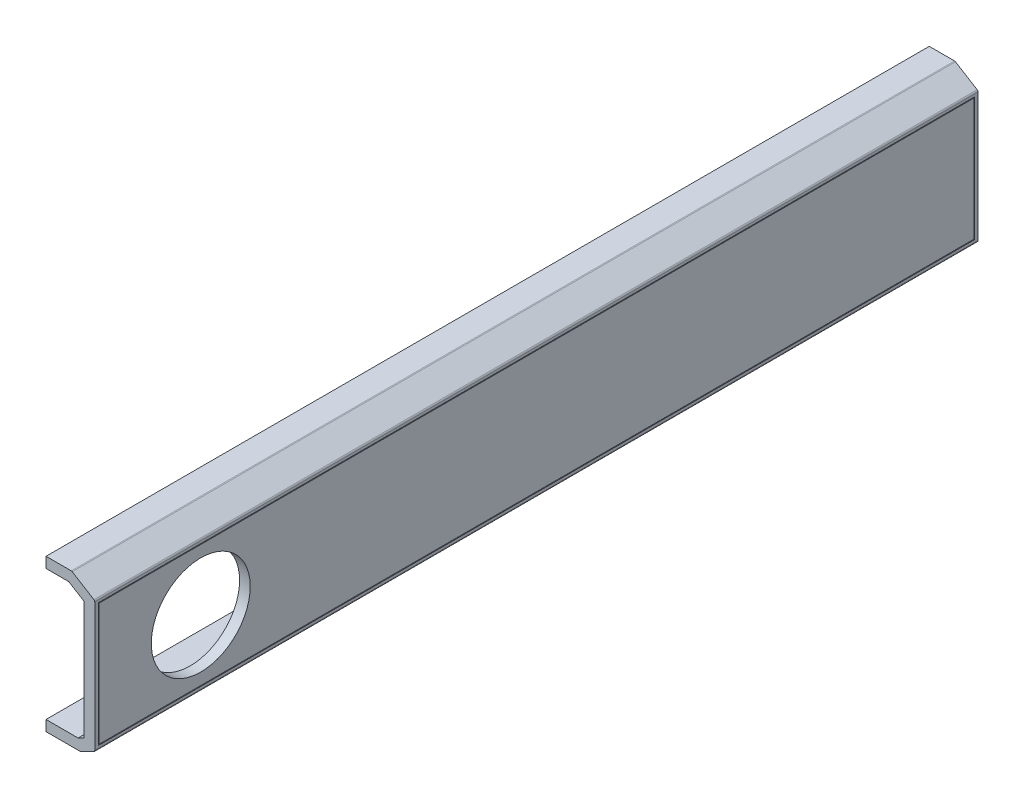
ISO-10303-21;
HEADER;
FILE_DESCRIPTION(('STEP AP214'),'2;1');
FILE_NAME('part.step','',(''),(''),'','','');
FILE_SCHEMA(('AUTOMOTIVE_DESIGN { 1 0 10303 214 1 1 1 1 }'));
ENDSEC;
DATA;
#1=APPLICATION_CONTEXT('core data for automotive mechanical design processes');
#2=APPLICATION_PROTOCOL_DEFINITION('international standard','automotive_design',2000,#1);
#3=PRODUCT_CONTEXT('',#1,'mechanical');
#4=PRODUCT('Part','Part','',(#3));
#5=PRODUCT_RELATED_PRODUCT_CATEGORY('part','',(#4));
#6=PRODUCT_DEFINITION_FORMATION('','',#4);
#7=PRODUCT_DEFINITION_CONTEXT('part definition',#1,'design');
#8=PRODUCT_DEFINITION('design','',#6,#7);
#9=PRODUCT_DEFINITION_SHAPE('','',#8);
#10=(LENGTH_UNIT() NAMED_UNIT(*) SI_UNIT(.MILLI.,.METRE.));
#11=(NAMED_UNIT(*) PLANE_ANGLE_UNIT() SI_UNIT($,.RADIAN.));
#12=(NAMED_UNIT(*) SI_UNIT($,.STERADIAN.) SOLID_ANGLE_UNIT());
#13=UNCERTAINTY_MEASURE_WITH_UNIT(LENGTH_MEASURE(1.E-05),#10,'distance_accuracy_value','');
#14=(GEOMETRIC_REPRESENTATION_CONTEXT(3) GLOBAL_UNCERTAINTY_ASSIGNED_CONTEXT((#13)) GLOBAL_UNIT_ASSIGNED_CONTEXT((#10,
#11,#12)) REPRESENTATION_CONTEXT('',''));
#15=CARTESIAN_POINT('',(0.,0.,0.));
#16=DIRECTION('',(0.,0.,1.));
#17=DIRECTION('',(1.,0.,0.));
#18=AXIS2_PLACEMENT_3D('',#15,#16,#17);
#19=CARTESIAN_POINT('',(13.6,0.,0.));
#20=DIRECTION('',(1.,0.,0.));
#21=DIRECTION('',(0.,0.,-1.));
#22=AXIS2_PLACEMENT_3D('',#19,#20,#21);
#23=PLANE('',#22);
#24=DIRECTION('',(0.,0.,1.));
#25=VECTOR('',#24,1.);
#26=CARTESIAN_POINT('',(13.6,38.,1.));
#27=LINE('',#26,#25);
#28=CARTESIAN_POINT('',(13.6,38.,1.));
#29=VERTEX_POINT('',#28);
#30=CARTESIAN_POINT('',(13.6,38.,249.));
#31=VERTEX_POINT('',#30);
#32=EDGE_CURVE('E466',#29,#31,#27,.T.);
#33=ORIENTED_EDGE('',*,*,#32,.T.);
#34=DIRECTION('',(0.,1.,0.));
#35=VECTOR('',#34,1.);
#36=CARTESIAN_POINT('',(13.6,38.,249.));
#37=LINE('',#36,#35);
#38=CARTESIAN_POINT('',(13.6,3.,249.));
#39=VERTEX_POINT('',#38);
#40=EDGE_CURVE('E461',#31,#39,#37,.F.);
#41=ORIENTED_EDGE('',*,*,#40,.T.);
#42=DIRECTION('',(0.,0.,-1.));
#43=VECTOR('',#42,1.);
#44=CARTESIAN_POINT('',(13.6,3.,249.));
#45=LINE('',#44,#43);
#46=CARTESIAN_POINT('',(13.6,3.,1.));
#47=VERTEX_POINT('',#46);
#48=EDGE_CURVE('E456',#39,#47,#45,.T.);
#49=ORIENTED_EDGE('',*,*,#48,.T.);
#50=DIRECTION('',(0.,1.,0.));
#51=VECTOR('',#50,1.);
#52=CARTESIAN_POINT('',(13.6,3.,1.));
#53=LINE('',#52,#51);
#54=EDGE_CURVE('E450',#47,#29,#53,.T.);
#55=ORIENTED_EDGE('',*,*,#54,.T.);
#56=EDGE_LOOP('',(#33,#41,#49,#55));
#57=FACE_BOUND('',#56,.T.);
#58=DIRECTION('',(0.,1.,0.));
#59=VECTOR('',#58,1.);
#60=CARTESIAN_POINT('',(13.6,37.8,248.8));
#61=LINE('',#60,#59);
#62=CARTESIAN_POINT('',(13.6,37.8,248.8));
#63=VERTEX_POINT('',#62);
#64=CARTESIAN_POINT('',(13.6,3.2,248.8));
#65=VERTEX_POINT('',#64);
#66=EDGE_CURVE('E477',#63,#65,#61,.F.);
#67=ORIENTED_EDGE('',*,*,#66,.F.);
#68=DIRECTION('',(0.,0.,1.));
#69=VECTOR('',#68,1.);
#70=CARTESIAN_POINT('',(13.6,37.8,1.2));
#71=LINE('',#70,#69);
#72=CARTESIAN_POINT('',(13.6,37.8,1.2));
#73=VERTEX_POINT('',#72);
#74=EDGE_CURVE('E470',#73,#63,#71,.T.);
#75=ORIENTED_EDGE('',*,*,#74,.F.);
#76=DIRECTION('',(0.,1.,0.));
#77=VECTOR('',#76,1.);
#78=CARTESIAN_POINT('',(13.6,3.2,1.2));
#79=LINE('',#78,#77);
#80=CARTESIAN_POINT('',(13.6,3.2,1.2));
#81=VERTEX_POINT('',#80);
#82=EDGE_CURVE('E483',#81,#73,#79,.T.);
#83=ORIENTED_EDGE('',*,*,#82,.F.);
#84=DIRECTION('',(0.,0.,-1.));
#85=VECTOR('',#84,1.);
#86=CARTESIAN_POINT('',(13.6,3.2,248.8));
#87=LINE('',#86,#85);
#88=EDGE_CURVE('E481',#65,#81,#87,.T.);
#89=ORIENTED_EDGE('',*,*,#88,.F.);
#90=EDGE_LOOP('',(#67,#75,#83,#89));
#91=FACE_BOUND('',#90,.T.);
#92=ADVANCED_FACE('F17',(#57,#91),#23,.T.);
#93=CARTESIAN_POINT('',(13.6,3.2,1.2));
#94=DIRECTION('',(0.,0.,-1.));
#95=DIRECTION('',(-1.,0.,0.));
#96=AXIS2_PLACEMENT_3D('',#93,#94,#95);
#97=PLANE('',#96);
#98=ORIENTED_EDGE('',*,*,#82,.T.);
#99=DIRECTION('',(1.,0.,0.));
#100=VECTOR('',#99,1.);
#101=CARTESIAN_POINT('',(13.6,37.8,1.2));
#102=LINE('',#101,#100);
#103=CARTESIAN_POINT('',(13.8,37.8,1.2));
#104=VERTEX_POINT('',#103);
#105=EDGE_CURVE('E472',#104,#73,#102,.F.);
#106=ORIENTED_EDGE('',*,*,#105,.F.);
#107=DIRECTION('',(0.,1.,0.));
#108=VECTOR('',#107,1.);
#109=CARTESIAN_POINT('',(13.8,2.,1.20000000000001));
#110=LINE('',#109,#108);
#111=CARTESIAN_POINT('',(13.8,3.2,1.2));
#112=VERTEX_POINT('',#111);
#113=EDGE_CURVE('E444',#104,#112,#110,.F.);
#114=ORIENTED_EDGE('',*,*,#113,.T.);
#115=DIRECTION('',(1.,0.,0.));
#116=VECTOR('',#115,1.);
#117=CARTESIAN_POINT('',(13.6,3.2,1.20000000000001));
#118=LINE('',#117,#116);
#119=EDGE_CURVE('E479',#81,#112,#118,.T.);
#120=ORIENTED_EDGE('',*,*,#119,.F.);
#121=EDGE_LOOP('',(#98,#106,#114,#120));
#122=FACE_BOUND('',#121,.T.);
#123=ADVANCED_FACE('F889',(#122),#97,.T.);
#124=CARTESIAN_POINT('',(13.6,3.2,248.8));
#125=DIRECTION('',(0.,-1.,0.));
#126=DIRECTION('',(0.,0.,-1.));
#127=AXIS2_PLACEMENT_3D('',#124,#125,#126);
#128=PLANE('',#127);
#129=ORIENTED_EDGE('',*,*,#88,.T.);
#130=ORIENTED_EDGE('',*,*,#119,.T.);
#131=DIRECTION('',(0.,0.,1.));
#132=VECTOR('',#131,1.);
#133=CARTESIAN_POINT('',(13.8,3.2,250.));
#134=LINE('',#133,#132);
#135=CARTESIAN_POINT('',(13.8,3.2,248.8));
#136=VERTEX_POINT('',#135);
#137=EDGE_CURVE('E441',#112,#136,#134,.T.);
#138=ORIENTED_EDGE('',*,*,#137,.T.);
#139=DIRECTION('',(1.,0.,0.));
#140=VECTOR('',#139,1.);
#141=CARTESIAN_POINT('',(13.6,3.2,248.8));
#142=LINE('',#141,#140);
#143=EDGE_CURVE('E475',#65,#136,#142,.T.);
#144=ORIENTED_EDGE('',*,*,#143,.F.);
#145=EDGE_LOOP('',(#129,#130,#138,#144));
#146=FACE_BOUND('',#145,.T.);
#147=ADVANCED_FACE('F880',(#146),#128,.T.);
#148=CARTESIAN_POINT('',(13.6,37.8,248.8));
#149=DIRECTION('',(0.,0.,1.));
#150=DIRECTION('',(1.,0.,0.));
#151=AXIS2_PLACEMENT_3D('',#148,#149,#150);
#152=PLANE('',#151);
#153=ORIENTED_EDGE('',*,*,#66,.T.);
#154=ORIENTED_EDGE('',*,*,#143,.T.);
#155=DIRECTION('',(0.,1.,0.));
#156=VECTOR('',#155,1.);
#157=CARTESIAN_POINT('',(13.8,2.,248.8));
#158=LINE('',#157,#156);
#159=CARTESIAN_POINT('',(13.8,37.8,248.8));
#160=VERTEX_POINT('',#159);
#161=EDGE_CURVE('E438',#136,#160,#158,.T.);
#162=ORIENTED_EDGE('',*,*,#161,.T.);
#163=DIRECTION('',(1.,0.,0.));
#164=VECTOR('',#163,1.);
#165=CARTESIAN_POINT('',(13.6,37.8,248.8));
#166=LINE('',#165,#164);
#167=EDGE_CURVE('E468',#63,#160,#166,.T.);
#168=ORIENTED_EDGE('',*,*,#167,.F.);
#169=EDGE_LOOP('',(#153,#154,#162,#168));
#170=FACE_BOUND('',#169,.T.);
#171=ADVANCED_FACE('F871',(#170),#152,.T.);
#172=CARTESIAN_POINT('',(13.6,37.8,1.2));
#173=DIRECTION('',(0.,1.,0.));
#174=DIRECTION('',(0.,0.,1.));
#175=AXIS2_PLACEMENT_3D('',#172,#173,#174);
#176=PLANE('',#175);
#177=ORIENTED_EDGE('',*,*,#74,.T.);
#178=ORIENTED_EDGE('',*,*,#167,.T.);
#179=DIRECTION('',(0.,0.,1.));
#180=VECTOR('',#179,1.);
#181=CARTESIAN_POINT('',(13.8,37.8,250.));
#182=LINE('',#181,#180);
#183=EDGE_CURVE('E389',#160,#104,#182,.F.);
#184=ORIENTED_EDGE('',*,*,#183,.T.);
#185=ORIENTED_EDGE('',*,*,#105,.T.);
#186=EDGE_LOOP('',(#177,#178,#184,#185));
#187=FACE_BOUND('',#186,.T.);
#188=ADVANCED_FACE('F862',(#187),#176,.T.);
#189=CARTESIAN_POINT('',(13.6,38.,1.));
#190=DIRECTION('',(0.,1.,0.));
#191=DIRECTION('',(0.,0.,1.));
#192=AXIS2_PLACEMENT_3D('',#189,#190,#191);
#193=PLANE('',#192);
#194=DIRECTION('',(1.,0.,0.));
#195=VECTOR('',#194,1.);
#196=CARTESIAN_POINT('',(13.6,38.,249.));
#197=LINE('',#196,#195);
#198=CARTESIAN_POINT('',(13.8,38.,249.));
#199=VERTEX_POINT('',#198);
#200=EDGE_CURVE('E463',#199,#31,#197,.F.);
#201=ORIENTED_EDGE('',*,*,#200,.T.);
#202=ORIENTED_EDGE('',*,*,#32,.F.);
#203=DIRECTION('',(-1.,0.,0.));
#204=VECTOR('',#203,1.);
#205=CARTESIAN_POINT('',(13.6,38.,1.));
#206=LINE('',#205,#204);
#207=CARTESIAN_POINT('',(13.8,38.,1.));
#208=VERTEX_POINT('',#207);
#209=EDGE_CURVE('E219',#29,#208,#206,.F.);
#210=ORIENTED_EDGE('',*,*,#209,.T.);
#211=DIRECTION('',(0.,0.,1.));
#212=VECTOR('',#211,1.);
#213=CARTESIAN_POINT('',(13.8,38.,250.));
#214=LINE('',#213,#212);
#215=EDGE_CURVE('E328',#208,#199,#214,.T.);
#216=ORIENTED_EDGE('',*,*,#215,.T.);
#217=EDGE_LOOP('',(#201,#202,#210,#216));
#218=FACE_BOUND('',#217,.T.);
#219=ADVANCED_FACE('F853',(#218),#193,.F.);
#220=CARTESIAN_POINT('',(13.6,38.,249.));
#221=DIRECTION('',(0.,0.,1.));
#222=DIRECTION('',(1.,0.,0.));
#223=AXIS2_PLACEMENT_3D('',#220,#221,#222);
#224=PLANE('',#223);
#225=DIRECTION('',(1.,0.,0.));
#226=VECTOR('',#225,1.);
#227=CARTESIAN_POINT('',(13.6,3.,249.));
#228=LINE('',#227,#226);
#229=CARTESIAN_POINT('',(13.8,3.,249.));
#230=VERTEX_POINT('',#229);
#231=EDGE_CURVE('E458',#230,#39,#228,.F.);
#232=ORIENTED_EDGE('',*,*,#231,.T.);
#233=ORIENTED_EDGE('',*,*,#40,.F.);
#234=ORIENTED_EDGE('',*,*,#200,.F.);
#235=DIRECTION('',(0.,1.,0.));
#236=VECTOR('',#235,1.);
#237=CARTESIAN_POINT('',(13.8,2.,249.));
#238=LINE('',#237,#236);
#239=EDGE_CURVE('E325',#199,#230,#238,.F.);
#240=ORIENTED_EDGE('',*,*,#239,.T.);
#241=EDGE_LOOP('',(#232,#233,#234,#240));
#242=FACE_BOUND('',#241,.T.);
#243=ADVANCED_FACE('F844',(#242),#224,.F.);
#244=CARTESIAN_POINT('',(13.6,3.,249.));
#245=DIRECTION('',(0.,-1.,0.));
#246=DIRECTION('',(0.,0.,-1.));
#247=AXIS2_PLACEMENT_3D('',#244,#245,#246);
#248=PLANE('',#247);
#249=DIRECTION('',(-1.,0.,0.));
#250=VECTOR('',#249,1.);
#251=CARTESIAN_POINT('',(13.6,3.,1.));
#252=LINE('',#251,#250);
#253=CARTESIAN_POINT('',(13.8,3.,1.));
#254=VERTEX_POINT('',#253);
#255=EDGE_CURVE('E453',#254,#47,#252,.T.);
#256=ORIENTED_EDGE('',*,*,#255,.T.);
#257=ORIENTED_EDGE('',*,*,#48,.F.);
#258=ORIENTED_EDGE('',*,*,#231,.F.);
#259=DIRECTION('',(0.,0.,1.));
#260=VECTOR('',#259,1.);
#261=CARTESIAN_POINT('',(13.8,3.,250.));
#262=LINE('',#261,#260);
#263=EDGE_CURVE('E322',#230,#254,#262,.F.);
#264=ORIENTED_EDGE('',*,*,#263,.T.);
#265=EDGE_LOOP('',(#256,#257,#258,#264));
#266=FACE_BOUND('',#265,.T.);
#267=ADVANCED_FACE('F835',(#266),#248,.F.);
#268=CARTESIAN_POINT('',(13.6,3.,1.));
#269=DIRECTION('',(0.,0.,-1.));
#270=DIRECTION('',(-1.,0.,0.));
#271=AXIS2_PLACEMENT_3D('',#268,#269,#270);
#272=PLANE('',#271);
#273=ORIENTED_EDGE('',*,*,#209,.F.);
#274=ORIENTED_EDGE('',*,*,#54,.F.);
#275=ORIENTED_EDGE('',*,*,#255,.F.);
#276=DIRECTION('',(0.,1.,0.));
#277=VECTOR('',#276,1.);
#278=CARTESIAN_POINT('',(13.8,2.,1.));
#279=LINE('',#278,#277);
#280=EDGE_CURVE('E229',#254,#208,#279,.T.);
#281=ORIENTED_EDGE('',*,*,#280,.T.);
#282=EDGE_LOOP('',(#273,#274,#275,#281));
#283=FACE_BOUND('',#282,.T.);
#284=ADVANCED_FACE('F827',(#283),#272,.F.);
#285=CARTESIAN_POINT('',(13.3,38.7206024029818,250.));
#286=DIRECTION('',(0.,0.,-1.));
#287=DIRECTION('',(-1.,0.,0.));
#288=AXIS2_PLACEMENT_3D('',#285,#286,#287);
#289=CYLINDRICAL_SURFACE('',#288,0.5);
#290=CARTESIAN_POINT('',(13.3,38.7206024029818,0.));
#291=DIRECTION('',(0.,0.,-1.));
#292=DIRECTION('',(-1.,0.,0.));
#293=AXIS2_PLACEMENT_3D('',#290,#291,#292);
#294=CIRCLE('',#293,0.5);
#295=CARTESIAN_POINT('',(13.8,38.7206024029818,0.));
#296=VERTEX_POINT('',#295);
#297=CARTESIAN_POINT('',(13.5620487128322,39.1464315613341,0.));
#298=VERTEX_POINT('',#297);
#299=EDGE_CURVE('E218',#296,#298,#294,.F.);
#300=ORIENTED_EDGE('',*,*,#299,.T.);
#301=DIRECTION('',(0.,0.,1.));
#302=VECTOR('',#301,1.);
#303=CARTESIAN_POINT('',(13.5620487128322,39.1464315613341,250.));
#304=LINE('',#303,#302);
#305=CARTESIAN_POINT('',(13.5620487128322,39.1464315613341,250.));
#306=VERTEX_POINT('',#305);
#307=EDGE_CURVE('E216',#298,#306,#304,.T.);
#308=ORIENTED_EDGE('',*,*,#307,.T.);
#309=CARTESIAN_POINT('',(13.3,38.7206024029818,250.));
#310=DIRECTION('',(0.,0.,-1.));
#311=DIRECTION('',(-1.,0.,0.));
#312=AXIS2_PLACEMENT_3D('',#309,#310,#311);
#313=CIRCLE('',#312,0.5);
#314=CARTESIAN_POINT('',(13.8,38.7206024029818,250.));
#315=VERTEX_POINT('',#314);
#316=EDGE_CURVE('E20',#306,#315,#313,.T.);
#317=ORIENTED_EDGE('',*,*,#316,.T.);
#318=DIRECTION('',(0.,0.,1.));
#319=VECTOR('',#318,1.);
#320=CARTESIAN_POINT('',(13.8,38.7206024029818,250.));
#321=LINE('',#320,#319);
#322=EDGE_CURVE('E213',#315,#296,#321,.F.);
#323=ORIENTED_EDGE('',*,*,#322,.T.);
#324=EDGE_LOOP('',(#300,#308,#317,#323));
#325=FACE_BOUND('',#324,.T.);
#326=ADVANCED_FACE('F212',(#325),#289,.T.);
#327=CARTESIAN_POINT('',(7.15847890484539,42.5,250.));
#328=DIRECTION('',(0.,0.,-1.));
#329=DIRECTION('',(-1.,0.,0.));
#330=AXIS2_PLACEMENT_3D('',#327,#328,#329);
#331=CYLINDRICAL_SURFACE('',#330,0.5);
#332=CARTESIAN_POINT('',(7.15847890484539,42.5,0.));
#333=DIRECTION('',(0.,0.,-1.));
#334=DIRECTION('',(-1.,0.,0.));
#335=AXIS2_PLACEMENT_3D('',#332,#333,#334);
#336=CIRCLE('',#335,0.5);
#337=CARTESIAN_POINT('',(7.42052761767756,42.9258291583523,0.));
#338=VERTEX_POINT('',#337);
#339=CARTESIAN_POINT('',(7.15847890484539,43.,0.));
#340=VERTEX_POINT('',#339);
#341=EDGE_CURVE('E447',#338,#340,#336,.F.);
#342=ORIENTED_EDGE('',*,*,#341,.T.);
#343=DIRECTION('',(0.,0.,-1.));
#344=VECTOR('',#343,1.);
#345=CARTESIAN_POINT('',(7.15847890484539,43.,250.));
#346=LINE('',#345,#344);
#347=CARTESIAN_POINT('',(7.15847890484539,43.,250.));
#348=VERTEX_POINT('',#347);
#349=EDGE_CURVE('E302',#340,#348,#346,.F.);
#350=ORIENTED_EDGE('',*,*,#349,.T.);
#351=CARTESIAN_POINT('',(7.15847890484539,42.5,250.));
#352=DIRECTION('',(0.,0.,-1.));
#353=DIRECTION('',(-1.,0.,0.));
#354=AXIS2_PLACEMENT_3D('',#351,#352,#353);
#355=CIRCLE('',#354,0.5);
#356=CARTESIAN_POINT('',(7.42052761767756,42.9258291583523,250.));
#357=VERTEX_POINT('',#356);
#358=EDGE_CURVE('E498',#348,#357,#355,.T.);
#359=ORIENTED_EDGE('',*,*,#358,.T.);
#360=DIRECTION('',(0.,0.,1.));
#361=VECTOR('',#360,1.);
#362=CARTESIAN_POINT('',(7.42052761767756,42.9258291583523,250.));
#363=LINE('',#362,#361);
#364=EDGE_CURVE('E317',#357,#338,#363,.F.);
#365=ORIENTED_EDGE('',*,*,#364,.T.);
#366=EDGE_LOOP('',(#342,#350,#359,#365));
#367=FACE_BOUND('',#366,.T.);
#368=ADVANCED_FACE('F810',(#367),#331,.T.);
#369=CARTESIAN_POINT('',(13.8,2.,250.));
#370=DIRECTION('',(-1.,0.,0.));
#371=DIRECTION('',(0.,0.,1.));
#372=AXIS2_PLACEMENT_3D('',#369,#370,#371);
#373=PLANE('',#372);
#374=CARTESIAN_POINT('',(13.8,20.5148096986784,220.));
#375=DIRECTION('',(1.,0.,0.));
#376=DIRECTION('',(0.,0.,-1.));
#377=AXIS2_PLACEMENT_3D('',#374,#375,#376);
#378=CIRCLE('',#377,14.);
#379=CARTESIAN_POINT('',(13.8,20.5148096986784,206.));
#380=VERTEX_POINT('',#379);
#381=EDGE_CURVE('E250',#380,#380,#378,.F.);
#382=ORIENTED_EDGE('',*,*,#381,.T.);
#383=EDGE_LOOP('',(#382));
#384=FACE_BOUND('',#383,.T.);
#385=ORIENTED_EDGE('',*,*,#161,.F.);
#386=ORIENTED_EDGE('',*,*,#137,.F.);
#387=ORIENTED_EDGE('',*,*,#113,.F.);
#388=ORIENTED_EDGE('',*,*,#183,.F.);
#389=EDGE_LOOP('',(#385,#386,#387,#388));
#390=FACE_BOUND('',#389,.T.);
#391=ADVANCED_FACE('F801',(#384,#390),#373,.F.);
#392=CARTESIAN_POINT('',(0.,3.,250.));
#393=DIRECTION('',(0.,-1.,0.));
#394=DIRECTION('',(0.,0.,-1.));
#395=AXIS2_PLACEMENT_3D('',#392,#393,#394);
#396=PLANE('',#395);
#397=DIRECTION('',(1.,0.,0.));
#398=VECTOR('',#397,1.);
#399=CARTESIAN_POINT('',(0.,3.,182.));
#400=LINE('',#399,#398);
#401=CARTESIAN_POINT('',(9.09179606750064,3.,182.));
#402=VERTEX_POINT('',#401);
#403=CARTESIAN_POINT('',(0.,3.,182.));
#404=VERTEX_POINT('',#403);
#405=EDGE_CURVE('E384',#402,#404,#400,.F.);
#406=ORIENTED_EDGE('',*,*,#405,.T.);
#407=DIRECTION('',(0.,0.,-1.));
#408=VECTOR('',#407,1.);
#409=CARTESIAN_POINT('',(0.,3.,250.));
#410=LINE('',#409,#408);
#411=CARTESIAN_POINT('',(0.,3.,250.));
#412=VERTEX_POINT('',#411);
#413=EDGE_CURVE('E377',#404,#412,#410,.F.);
#414=ORIENTED_EDGE('',*,*,#413,.T.);
#415=DIRECTION('',(1.,0.,0.));
#416=VECTOR('',#415,1.);
#417=CARTESIAN_POINT('',(0.,3.,250.));
#418=LINE('',#417,#416);
#419=CARTESIAN_POINT('',(9.09179606750064,3.,250.));
#420=VERTEX_POINT('',#419);
#421=EDGE_CURVE('E416',#420,#412,#418,.F.);
#422=ORIENTED_EDGE('',*,*,#421,.F.);
#423=DIRECTION('',(0.,0.,1.));
#424=VECTOR('',#423,1.);
#425=CARTESIAN_POINT('',(9.09179606750064,3.,250.));
#426=LINE('',#425,#424);
#427=EDGE_CURVE('E399',#420,#402,#426,.F.);
#428=ORIENTED_EDGE('',*,*,#427,.T.);
#429=EDGE_LOOP('',(#406,#414,#422,#428));
#430=FACE_BOUND('',#429,.T.);
#431=ADVANCED_FACE('F792',(#430),#396,.F.);
#432=CARTESIAN_POINT('',(0.,3.,250.));
#433=DIRECTION('',(1.,0.,0.));
#434=DIRECTION('',(0.,0.,-1.));
#435=AXIS2_PLACEMENT_3D('',#432,#433,#434);
#436=PLANE('',#435);
#437=DIRECTION('',(0.,1.,0.));
#438=VECTOR('',#437,1.);
#439=CARTESIAN_POINT('',(0.,43.001,182.));
#440=LINE('',#439,#438);
#441=CARTESIAN_POINT('',(0.,0.,182.));
#442=VERTEX_POINT('',#441);
#443=EDGE_CURVE('E380',#404,#442,#440,.F.);
#444=ORIENTED_EDGE('',*,*,#443,.T.);
#445=DIRECTION('',(0.,0.,1.));
#446=VECTOR('',#445,1.);
#447=CARTESIAN_POINT('',(0.,0.,250.));
#448=LINE('',#447,#446);
#449=CARTESIAN_POINT('',(0.,0.,250.));
#450=VERTEX_POINT('',#449);
#451=EDGE_CURVE('E375',#442,#450,#448,.T.);
#452=ORIENTED_EDGE('',*,*,#451,.T.);
#453=DIRECTION('',(0.,1.,0.));
#454=VECTOR('',#453,1.);
#455=CARTESIAN_POINT('',(0.,0.,250.));
#456=LINE('',#455,#454);
#457=EDGE_CURVE('E413',#412,#450,#456,.F.);
#458=ORIENTED_EDGE('',*,*,#457,.F.);
#459=ORIENTED_EDGE('',*,*,#413,.F.);
#460=EDGE_LOOP('',(#444,#452,#458,#459));
#461=FACE_BOUND('',#460,.T.);
#462=ADVANCED_FACE('F783',(#461),#436,.F.);
#463=CARTESIAN_POINT('',(0.,0.,250.));
#464=DIRECTION('',(0.,1.,0.));
#465=DIRECTION('',(0.,0.,1.));
#466=AXIS2_PLACEMENT_3D('',#463,#464,#465);
#467=PLANE('',#466);
#468=DIRECTION('',(0.,0.,-1.));
#469=VECTOR('',#468,1.);
#470=CARTESIAN_POINT('',(9.6819660112501,0.,250.));
#471=LINE('',#470,#469);
#472=CARTESIAN_POINT('',(9.6819660112501,0.,250.));
#473=VERTEX_POINT('',#472);
#474=CARTESIAN_POINT('',(9.6819660112501,0.,182.));
#475=VERTEX_POINT('',#474);
#476=EDGE_CURVE('E372',#473,#475,#471,.T.);
#477=ORIENTED_EDGE('',*,*,#476,.F.);
#478=DIRECTION('',(1.,0.,0.));
#479=VECTOR('',#478,1.);
#480=CARTESIAN_POINT('',(0.,0.,250.));
#481=LINE('',#480,#479);
#482=EDGE_CURVE('E243',#450,#473,#481,.T.);
#483=ORIENTED_EDGE('',*,*,#482,.F.);
#484=ORIENTED_EDGE('',*,*,#451,.F.);
#485=DIRECTION('',(1.,0.,0.));
#486=VECTOR('',#485,1.);
#487=CARTESIAN_POINT('',(0.,0.,182.));
#488=LINE('',#487,#486);
#489=EDGE_CURVE('E383',#442,#475,#488,.T.);
#490=ORIENTED_EDGE('',*,*,#489,.T.);
#491=EDGE_LOOP('',(#477,#483,#484,#490));
#492=FACE_BOUND('',#491,.T.);
#493=ADVANCED_FACE('F592',(#492),#467,.F.);
#494=CARTESIAN_POINT('',(9.6819660112501,0.5,250.));
#495=DIRECTION('',(0.,0.,-1.));
#496=DIRECTION('',(-1.,0.,0.));
#497=AXIS2_PLACEMENT_3D('',#494,#495,#496);
#498=CYLINDRICAL_SURFACE('',#497,0.5);
#499=CARTESIAN_POINT('',(9.6819660112501,0.5,182.));
#500=DIRECTION('',(0.,0.,-1.));
#501=DIRECTION('',(-1.,0.,0.));
#502=AXIS2_PLACEMENT_3D('',#499,#500,#501);
#503=CIRCLE('',#502,0.5);
#504=CARTESIAN_POINT('',(9.90557280900008,0.0527864045000421,182.));
#505=VERTEX_POINT('',#504);
#506=EDGE_CURVE('E364',#475,#505,#503,.F.);
#507=ORIENTED_EDGE('',*,*,#506,.T.);
#508=DIRECTION('',(0.,0.,1.));
#509=VECTOR('',#508,1.);
#510=CARTESIAN_POINT('',(9.90557280900008,0.0527864045000419,250.));
#511=LINE('',#510,#509);
#512=CARTESIAN_POINT('',(9.90557280900008,0.0527864045000421,250.));
#513=VERTEX_POINT('',#512);
#514=EDGE_CURVE('E358',#505,#513,#511,.T.);
#515=ORIENTED_EDGE('',*,*,#514,.T.);
#516=CARTESIAN_POINT('',(9.6819660112501,0.5,250.));
#517=DIRECTION('',(0.,0.,-1.));
#518=DIRECTION('',(-1.,0.,0.));
#519=AXIS2_PLACEMENT_3D('',#516,#517,#518);
#520=CIRCLE('',#519,0.5);
#521=EDGE_CURVE('E239',#473,#513,#520,.F.);
#522=ORIENTED_EDGE('',*,*,#521,.F.);
#523=ORIENTED_EDGE('',*,*,#476,.T.);
#524=EDGE_LOOP('',(#507,#515,#522,#523));
#525=FACE_BOUND('',#524,.T.);
#526=ADVANCED_FACE('F583',(#525),#498,.T.);
#527=CARTESIAN_POINT('',(13.3,2.30901699437495,250.));
#528=DIRECTION('',(0.,0.,-1.));
#529=DIRECTION('',(-1.,0.,0.));
#530=AXIS2_PLACEMENT_3D('',#527,#528,#529);
#531=CYLINDRICAL_SURFACE('',#530,0.5);
#532=CARTESIAN_POINT('',(13.3,2.30901699437495,0.));
#533=DIRECTION('',(0.,0.,-1.));
#534=DIRECTION('',(-1.,0.,0.));
#535=AXIS2_PLACEMENT_3D('',#532,#533,#534);
#536=CIRCLE('',#535,0.5);
#537=CARTESIAN_POINT('',(13.52360679775,1.86180339887499,0.));
#538=VERTEX_POINT('',#537);
#539=CARTESIAN_POINT('',(13.8,2.30901699437495,0.));
#540=VERTEX_POINT('',#539);
#541=EDGE_CURVE('E374',#538,#540,#536,.F.);
#542=ORIENTED_EDGE('',*,*,#541,.T.);
#543=DIRECTION('',(0.,0.,1.));
#544=VECTOR('',#543,1.);
#545=CARTESIAN_POINT('',(13.8,2.30901699437495,250.));
#546=LINE('',#545,#544);
#547=CARTESIAN_POINT('',(13.8,2.30901699437495,250.));
#548=VERTEX_POINT('',#547);
#549=EDGE_CURVE('E228',#540,#548,#546,.T.);
#550=ORIENTED_EDGE('',*,*,#549,.T.);
#551=CARTESIAN_POINT('',(13.3,2.30901699437495,250.));
#552=DIRECTION('',(0.,0.,-1.));
#553=DIRECTION('',(-1.,0.,0.));
#554=AXIS2_PLACEMENT_3D('',#551,#552,#553);
#555=CIRCLE('',#554,0.5);
#556=CARTESIAN_POINT('',(13.52360679775,1.86180339887499,250.));
#557=VERTEX_POINT('',#556);
#558=EDGE_CURVE('E233',#557,#548,#555,.F.);
#559=ORIENTED_EDGE('',*,*,#558,.F.);
#560=DIRECTION('',(0.,0.,1.));
#561=VECTOR('',#560,1.);
#562=CARTESIAN_POINT('',(13.52360679775,1.86180339887499,250.));
#563=LINE('',#562,#561);
#564=EDGE_CURVE('E255',#557,#538,#563,.F.);
#565=ORIENTED_EDGE('',*,*,#564,.T.);
#566=EDGE_LOOP('',(#542,#550,#559,#565));
#567=FACE_BOUND('',#566,.T.);
#568=ADVANCED_FACE('F580',(#567),#531,.T.);
#569=CARTESIAN_POINT('',(9.6819660112501,0.5,250.));
#570=DIRECTION('',(0.,0.,-1.));
#571=DIRECTION('',(-1.,0.,0.));
#572=AXIS2_PLACEMENT_3D('',#569,#570,#571);
#573=CYLINDRICAL_SURFACE('',#572,0.5);
#574=CARTESIAN_POINT('',(9.6819660112501,0.5,0.));
#575=DIRECTION('',(0.,0.,-1.));
#576=DIRECTION('',(-1.,0.,0.));
#577=AXIS2_PLACEMENT_3D('',#574,#575,#576);
#578=CIRCLE('',#577,0.5);
#579=CARTESIAN_POINT('',(9.6819660112501,0.,0.));
#580=VERTEX_POINT('',#579);
#581=CARTESIAN_POINT('',(9.90557280900008,0.0527864045000421,0.));
#582=VERTEX_POINT('',#581);
#583=EDGE_CURVE('E331',#580,#582,#578,.F.);
#584=ORIENTED_EDGE('',*,*,#583,.T.);
#585=DIRECTION('',(0.,0.,1.));
#586=VECTOR('',#585,1.);
#587=CARTESIAN_POINT('',(9.90557280900008,0.0527864045000419,250.));
#588=LINE('',#587,#586);
#589=CARTESIAN_POINT('',(9.90557280900008,0.0527864045000406,68.));
#590=VERTEX_POINT('',#589);
#591=EDGE_CURVE('E251',#582,#590,#588,.T.);
#592=ORIENTED_EDGE('',*,*,#591,.T.);
#593=CARTESIAN_POINT('',(9.6819660112501,0.5,68.));
#594=DIRECTION('',(0.,0.,-1.));
#595=DIRECTION('',(-1.,0.,0.));
#596=AXIS2_PLACEMENT_3D('',#593,#594,#595);
#597=CIRCLE('',#596,0.5);
#598=CARTESIAN_POINT('',(9.6819660112501,0.,68.));
#599=VERTEX_POINT('',#598);
#600=EDGE_CURVE('E494',#590,#599,#597,.T.);
#601=ORIENTED_EDGE('',*,*,#600,.T.);
#602=DIRECTION('',(0.,0.,1.));
#603=VECTOR('',#602,1.);
#604=CARTESIAN_POINT('',(9.6819660112501,0.,250.));
#605=LINE('',#604,#603);
#606=EDGE_CURVE('E259',#599,#580,#605,.F.);
#607=ORIENTED_EDGE('',*,*,#606,.T.);
#608=EDGE_LOOP('',(#584,#592,#601,#607));
#609=FACE_BOUND('',#608,.T.);
#610=ADVANCED_FACE('F582',(#609),#573,.T.);
#611=CARTESIAN_POINT('',(13.8,2.,250.));
#612=DIRECTION('',(-1.,0.,0.));
#613=DIRECTION('',(0.,0.,1.));
#614=AXIS2_PLACEMENT_3D('',#611,#612,#613);
#615=PLANE('',#614);
#616=ORIENTED_EDGE('',*,*,#549,.F.);
#617=DIRECTION('',(0.,1.,0.));
#618=VECTOR('',#617,1.);
#619=CARTESIAN_POINT('',(13.8,0.,0.));
#620=LINE('',#619,#618);
#621=EDGE_CURVE('E227',#540,#296,#620,.T.);
#622=ORIENTED_EDGE('',*,*,#621,.T.);
#623=ORIENTED_EDGE('',*,*,#322,.F.);
#624=DIRECTION('',(0.,1.,0.));
#625=VECTOR('',#624,1.);
#626=CARTESIAN_POINT('',(13.8,0.,250.));
#627=LINE('',#626,#625);
#628=EDGE_CURVE('E225',#548,#315,#627,.T.);
#629=ORIENTED_EDGE('',*,*,#628,.F.);
#630=EDGE_LOOP('',(#616,#622,#623,#629));
#631=FACE_BOUND('',#630,.T.);
#632=ORIENTED_EDGE('',*,*,#263,.F.);
#633=ORIENTED_EDGE('',*,*,#239,.F.);
#634=ORIENTED_EDGE('',*,*,#215,.F.);
#635=ORIENTED_EDGE('',*,*,#280,.F.);
#636=EDGE_LOOP('',(#632,#633,#634,#635));
#637=FACE_BOUND('',#636,.T.);
#638=ADVANCED_FACE('F223',(#631,#637),#615,.F.);
#639=CARTESIAN_POINT('',(7.3,43.,250.));
#640=DIRECTION('',(-0.524097425664335,-0.851658316704544,0.));
#641=DIRECTION('',(0.851658316704544,-0.524097425664335,0.));
#642=AXIS2_PLACEMENT_3D('',#639,#640,#641);
#643=PLANE('',#642);
#644=ORIENTED_EDGE('',*,*,#307,.F.);
#645=DIRECTION('',(-0.851658316704544,0.524097425664334,0.));
#646=VECTOR('',#645,1.);
#647=CARTESIAN_POINT('',(13.5620487128322,39.1464315613341,0.));
#648=LINE('',#647,#646);
#649=EDGE_CURVE('E504',#298,#338,#648,.T.);
#650=ORIENTED_EDGE('',*,*,#649,.T.);
#651=ORIENTED_EDGE('',*,*,#364,.F.);
#652=DIRECTION('',(-0.851658316704544,0.524097425664334,0.));
#653=VECTOR('',#652,1.);
#654=CARTESIAN_POINT('',(13.5620487128322,39.1464315613341,250.));
#655=LINE('',#654,#653);
#656=EDGE_CURVE('E235',#306,#357,#655,.T.);
#657=ORIENTED_EDGE('',*,*,#656,.F.);
#658=EDGE_LOOP('',(#644,#650,#651,#657));
#659=FACE_BOUND('',#658,.T.);
#660=ADVANCED_FACE('F502',(#659),#643,.F.);
#661=CARTESIAN_POINT('',(7.3,43.,250.));
#662=DIRECTION('',(0.,-1.,0.));
#663=DIRECTION('',(0.,0.,-1.));
#664=AXIS2_PLACEMENT_3D('',#661,#662,#663);
#665=PLANE('',#664);
#666=ORIENTED_EDGE('',*,*,#349,.F.);
#667=DIRECTION('',(1.,0.,0.));
#668=VECTOR('',#667,1.);
#669=CARTESIAN_POINT('',(0.,43.,0.));
#670=LINE('',#669,#668);
#671=CARTESIAN_POINT('',(0.,43.,0.));
#672=VERTEX_POINT('',#671);
#673=EDGE_CURVE('E309',#340,#672,#670,.F.);
#674=ORIENTED_EDGE('',*,*,#673,.T.);
#675=DIRECTION('',(0.,0.,1.));
#676=VECTOR('',#675,1.);
#677=CARTESIAN_POINT('',(0.,43.,250.));
#678=LINE('',#677,#676);
#679=CARTESIAN_POINT('',(0.,43.,250.));
#680=VERTEX_POINT('',#679);
#681=EDGE_CURVE('E301',#672,#680,#678,.T.);
#682=ORIENTED_EDGE('',*,*,#681,.T.);
#683=DIRECTION('',(1.,0.,0.));
#684=VECTOR('',#683,1.);
#685=CARTESIAN_POINT('',(0.,43.,250.));
#686=LINE('',#685,#684);
#687=EDGE_CURVE('E237',#348,#680,#686,.F.);
#688=ORIENTED_EDGE('',*,*,#687,.F.);
#689=EDGE_LOOP('',(#666,#674,#682,#688));
#690=FACE_BOUND('',#689,.T.);
#691=ADVANCED_FACE('F535',(#690),#665,.F.);
#692=CARTESIAN_POINT('',(0.,43.,250.));
#693=DIRECTION('',(1.,0.,0.));
#694=DIRECTION('',(0.,1.,0.));
#695=AXIS2_PLACEMENT_3D('',#692,#693,#694);
#696=PLANE('',#695);
#697=DIRECTION('',(0.,0.,1.));
#698=VECTOR('',#697,1.);
#699=CARTESIAN_POINT('',(0.,40.,250.));
#700=LINE('',#699,#698);
#701=CARTESIAN_POINT('',(0.,40.,0.));
#702=VERTEX_POINT('',#701);
#703=CARTESIAN_POINT('',(0.,40.,250.));
#704=VERTEX_POINT('',#703);
#705=EDGE_CURVE('E276',#702,#704,#700,.T.);
#706=ORIENTED_EDGE('',*,*,#705,.T.);
#707=DIRECTION('',(0.,1.,0.));
#708=VECTOR('',#707,1.);
#709=CARTESIAN_POINT('',(0.,0.,250.));
#710=LINE('',#709,#708);
#711=EDGE_CURVE('E430',#680,#704,#710,.F.);
#712=ORIENTED_EDGE('',*,*,#711,.F.);
#713=ORIENTED_EDGE('',*,*,#681,.F.);
#714=DIRECTION('',(0.,1.,0.));
#715=VECTOR('',#714,1.);
#716=CARTESIAN_POINT('',(0.,0.,0.));
#717=LINE('',#716,#715);
#718=EDGE_CURVE('E305',#672,#702,#717,.F.);
#719=ORIENTED_EDGE('',*,*,#718,.T.);
#720=EDGE_LOOP('',(#706,#712,#713,#719));
#721=FACE_BOUND('',#720,.T.);
#722=ADVANCED_FACE('F538',(#721),#696,.F.);
#723=CARTESIAN_POINT('',(6.45087342907236,40.,250.));
#724=DIRECTION('',(0.,1.,0.));
#725=DIRECTION('',(0.,0.,1.));
#726=AXIS2_PLACEMENT_3D('',#723,#724,#725);
#727=PLANE('',#726);
#728=DIRECTION('',(0.,0.,1.));
#729=VECTOR('',#728,1.);
#730=CARTESIAN_POINT('',(6.45087342907236,40.,250.));
#731=LINE('',#730,#729);
#732=CARTESIAN_POINT('',(6.45087342907236,40.,0.));
#733=VERTEX_POINT('',#732);
#734=CARTESIAN_POINT('',(6.45087342907236,40.,250.));
#735=VERTEX_POINT('',#734);
#736=EDGE_CURVE('E245',#733,#735,#731,.T.);
#737=ORIENTED_EDGE('',*,*,#736,.T.);
#738=DIRECTION('',(1.,0.,0.));
#739=VECTOR('',#738,1.);
#740=CARTESIAN_POINT('',(0.,40.,250.));
#741=LINE('',#740,#739);
#742=EDGE_CURVE('E433',#704,#735,#741,.T.);
#743=ORIENTED_EDGE('',*,*,#742,.F.);
#744=ORIENTED_EDGE('',*,*,#705,.F.);
#745=DIRECTION('',(1.,0.,0.));
#746=VECTOR('',#745,1.);
#747=CARTESIAN_POINT('',(0.,40.,0.));
#748=LINE('',#747,#746);
#749=EDGE_CURVE('E308',#702,#733,#748,.T.);
#750=ORIENTED_EDGE('',*,*,#749,.T.);
#751=EDGE_LOOP('',(#737,#743,#744,#750));
#752=FACE_BOUND('',#751,.T.);
#753=ADVANCED_FACE('F544',(#752),#727,.F.);
#754=CARTESIAN_POINT('',(0.,3.,250.));
#755=DIRECTION('',(0.,-1.,0.));
#756=DIRECTION('',(0.,0.,-1.));
#757=AXIS2_PLACEMENT_3D('',#754,#755,#756);
#758=PLANE('',#757);
#759=DIRECTION('',(-1.,0.,0.));
#760=VECTOR('',#759,1.);
#761=CARTESIAN_POINT('',(0.,3.,68.));
#762=LINE('',#761,#760);
#763=CARTESIAN_POINT('',(0.,3.,68.));
#764=VERTEX_POINT('',#763);
#765=CARTESIAN_POINT('',(9.09179606750064,3.,68.));
#766=VERTEX_POINT('',#765);
#767=EDGE_CURVE('E338',#764,#766,#762,.F.);
#768=ORIENTED_EDGE('',*,*,#767,.T.);
#769=DIRECTION('',(0.,0.,1.));
#770=VECTOR('',#769,1.);
#771=CARTESIAN_POINT('',(9.09179606750064,3.,250.));
#772=LINE('',#771,#770);
#773=CARTESIAN_POINT('',(9.09179606750064,3.,0.));
#774=VERTEX_POINT('',#773);
#775=EDGE_CURVE('E287',#766,#774,#772,.F.);
#776=ORIENTED_EDGE('',*,*,#775,.T.);
#777=DIRECTION('',(1.,0.,0.));
#778=VECTOR('',#777,1.);
#779=CARTESIAN_POINT('',(0.,3.,0.));
#780=LINE('',#779,#778);
#781=CARTESIAN_POINT('',(0.,3.,0.));
#782=VERTEX_POINT('',#781);
#783=EDGE_CURVE('E272',#774,#782,#780,.F.);
#784=ORIENTED_EDGE('',*,*,#783,.T.);
#785=DIRECTION('',(0.,0.,-1.));
#786=VECTOR('',#785,1.);
#787=CARTESIAN_POINT('',(0.,3.,250.));
#788=LINE('',#787,#786);
#789=EDGE_CURVE('E265',#782,#764,#788,.F.);
#790=ORIENTED_EDGE('',*,*,#789,.T.);
#791=EDGE_LOOP('',(#768,#776,#784,#790));
#792=FACE_BOUND('',#791,.T.);
#793=ADVANCED_FACE('F635',(#792),#758,.F.);
#794=CARTESIAN_POINT('',(0.,3.,250.));
#795=DIRECTION('',(1.,0.,0.));
#796=DIRECTION('',(0.,0.,-1.));
#797=AXIS2_PLACEMENT_3D('',#794,#795,#796);
#798=PLANE('',#797);
#799=DIRECTION('',(0.,1.,0.));
#800=VECTOR('',#799,1.);
#801=CARTESIAN_POINT('',(0.,43.001,68.));
#802=LINE('',#801,#800);
#803=CARTESIAN_POINT('',(0.,0.,68.));
#804=VERTEX_POINT('',#803);
#805=EDGE_CURVE('E254',#804,#764,#802,.T.);
#806=ORIENTED_EDGE('',*,*,#805,.T.);
#807=ORIENTED_EDGE('',*,*,#789,.F.);
#808=DIRECTION('',(0.,1.,0.));
#809=VECTOR('',#808,1.);
#810=CARTESIAN_POINT('',(0.,0.,0.));
#811=LINE('',#810,#809);
#812=CARTESIAN_POINT('',(0.,0.,0.));
#813=VERTEX_POINT('',#812);
#814=EDGE_CURVE('E268',#782,#813,#811,.F.);
#815=ORIENTED_EDGE('',*,*,#814,.T.);
#816=DIRECTION('',(0.,0.,1.));
#817=VECTOR('',#816,1.);
#818=CARTESIAN_POINT('',(0.,0.,250.));
#819=LINE('',#818,#817);
#820=EDGE_CURVE('E262',#813,#804,#819,.T.);
#821=ORIENTED_EDGE('',*,*,#820,.T.);
#822=EDGE_LOOP('',(#806,#807,#815,#821));
#823=FACE_BOUND('',#822,.T.);
#824=ADVANCED_FACE('F631',(#823),#798,.F.);
#825=CARTESIAN_POINT('',(0.,0.,250.));
#826=DIRECTION('',(0.,1.,0.));
#827=DIRECTION('',(0.,0.,1.));
#828=AXIS2_PLACEMENT_3D('',#825,#826,#827);
#829=PLANE('',#828);
#830=ORIENTED_EDGE('',*,*,#606,.F.);
#831=DIRECTION('',(-1.,0.,0.));
#832=VECTOR('',#831,1.);
#833=CARTESIAN_POINT('',(0.,0.,68.));
#834=LINE('',#833,#832);
#835=EDGE_CURVE('E335',#599,#804,#834,.T.);
#836=ORIENTED_EDGE('',*,*,#835,.T.);
#837=ORIENTED_EDGE('',*,*,#820,.F.);
#838=DIRECTION('',(1.,0.,0.));
#839=VECTOR('',#838,1.);
#840=CARTESIAN_POINT('',(0.,0.,0.));
#841=LINE('',#840,#839);
#842=EDGE_CURVE('E271',#813,#580,#841,.T.);
#843=ORIENTED_EDGE('',*,*,#842,.T.);
#844=EDGE_LOOP('',(#830,#836,#837,#843));
#845=FACE_BOUND('',#844,.T.);
#846=ADVANCED_FACE('F627',(#845),#829,.F.);
#847=CARTESIAN_POINT('',(0.,20.5148096986784,220.));
#848=DIRECTION('',(1.,0.,0.));
#849=DIRECTION('',(0.,0.,-1.));
#850=AXIS2_PLACEMENT_3D('',#847,#848,#849);
#851=CYLINDRICAL_SURFACE('',#850,14.);
#852=CARTESIAN_POINT('',(10.8,20.5148096986784,220.));
#853=DIRECTION('',(1.,0.,0.));
#854=DIRECTION('',(0.,0.,-1.));
#855=AXIS2_PLACEMENT_3D('',#852,#853,#854);
#856=CIRCLE('',#855,14.);
#857=CARTESIAN_POINT('',(10.8,20.5148096986784,206.));
#858=VERTEX_POINT('',#857);
#859=EDGE_CURVE('E485',#858,#858,#856,.F.);
#860=ORIENTED_EDGE('',*,*,#859,.T.);
#861=EDGE_LOOP('',(#860));
#862=FACE_BOUND('',#861,.T.);
#863=ORIENTED_EDGE('',*,*,#381,.F.);
#864=EDGE_LOOP('',(#863));
#865=FACE_BOUND('',#864,.T.);
#866=ADVANCED_FACE('F624',(#862,#865),#851,.F.);
#867=CARTESIAN_POINT('',(10.8,37.3236144178907,250.));
#868=DIRECTION('',(0.524097425664335,0.851658316704544,0.));
#869=DIRECTION('',(-0.851658316704544,0.524097425664335,0.));
#870=AXIS2_PLACEMENT_3D('',#867,#868,#869);
#871=PLANE('',#870);
#872=DIRECTION('',(0.,0.,-1.));
#873=VECTOR('',#872,1.);
#874=CARTESIAN_POINT('',(10.8,37.3236144178907,250.));
#875=LINE('',#874,#873);
#876=CARTESIAN_POINT('',(10.8,37.3236144178907,0.));
#877=VERTEX_POINT('',#876);
#878=CARTESIAN_POINT('',(10.8,37.3236144178907,250.));
#879=VERTEX_POINT('',#878);
#880=EDGE_CURVE('E423',#877,#879,#875,.F.);
#881=ORIENTED_EDGE('',*,*,#880,.T.);
#882=DIRECTION('',(0.851658316704544,-0.524097425664334,0.));
#883=VECTOR('',#882,1.);
#884=CARTESIAN_POINT('',(6.45087342907236,40.,250.));
#885=LINE('',#884,#883);
#886=EDGE_CURVE('E418',#735,#879,#885,.T.);
#887=ORIENTED_EDGE('',*,*,#886,.F.);
#888=ORIENTED_EDGE('',*,*,#736,.F.);
#889=DIRECTION('',(0.851658316704544,-0.524097425664334,0.));
#890=VECTOR('',#889,1.);
#891=CARTESIAN_POINT('',(6.45087342907236,40.,0.));
#892=LINE('',#891,#890);
#893=EDGE_CURVE('E284',#733,#877,#892,.T.);
#894=ORIENTED_EDGE('',*,*,#893,.T.);
#895=EDGE_LOOP('',(#881,#887,#888,#894));
#896=FACE_BOUND('',#895,.T.);
#897=ADVANCED_FACE('F563',(#896),#871,.F.);
#898=CARTESIAN_POINT('',(0.,0.,250.));
#899=DIRECTION('',(0.,0.,1.));
#900=DIRECTION('',(1.,0.,0.));
#901=AXIS2_PLACEMENT_3D('',#898,#899,#900);
#902=PLANE('',#901);
#903=ORIENTED_EDGE('',*,*,#421,.T.);
#904=ORIENTED_EDGE('',*,*,#457,.T.);
#905=ORIENTED_EDGE('',*,*,#482,.T.);
#906=ORIENTED_EDGE('',*,*,#521,.T.);
#907=DIRECTION('',(-0.894427190999916,-0.447213595499958,0.));
#908=VECTOR('',#907,1.);
#909=CARTESIAN_POINT('',(13.8,2.,250.));
#910=LINE('',#909,#908);
#911=EDGE_CURVE('E258',#513,#557,#910,.F.);
#912=ORIENTED_EDGE('',*,*,#911,.T.);
#913=ORIENTED_EDGE('',*,*,#558,.T.);
#914=ORIENTED_EDGE('',*,*,#628,.T.);
#915=ORIENTED_EDGE('',*,*,#316,.F.);
#916=ORIENTED_EDGE('',*,*,#656,.T.);
#917=ORIENTED_EDGE('',*,*,#358,.F.);
#918=ORIENTED_EDGE('',*,*,#687,.T.);
#919=ORIENTED_EDGE('',*,*,#711,.T.);
#920=ORIENTED_EDGE('',*,*,#742,.T.);
#921=ORIENTED_EDGE('',*,*,#886,.T.);
#922=DIRECTION('',(0.,1.,0.));
#923=VECTOR('',#922,1.);
#924=CARTESIAN_POINT('',(10.8,3.85410196624968,250.));
#925=LINE('',#924,#923);
#926=CARTESIAN_POINT('',(10.8,3.85410196624968,250.));
#927=VERTEX_POINT('',#926);
#928=EDGE_CURVE('E408',#879,#927,#925,.F.);
#929=ORIENTED_EDGE('',*,*,#928,.T.);
#930=DIRECTION('',(0.894427190999916,0.447213595499958,0.));
#931=VECTOR('',#930,1.);
#932=CARTESIAN_POINT('',(9.09179606750064,3.,250.));
#933=LINE('',#932,#931);
#934=EDGE_CURVE('E403',#927,#420,#933,.F.);
#935=ORIENTED_EDGE('',*,*,#934,.T.);
#936=EDGE_LOOP('',(#903,#904,#905,#906,#912,#913,#914,#915,#916,#917,#918,#919,#920,#921,#929,#935));
#937=FACE_BOUND('',#936,.T.);
#938=ADVANCED_FACE('F231',(#937),#902,.T.);
#939=CARTESIAN_POINT('',(9.09179606750064,3.,250.));
#940=DIRECTION('',(0.447213595499958,-0.894427190999916,0.));
#941=DIRECTION('',(0.894427190999916,0.447213595499958,0.));
#942=AXIS2_PLACEMENT_3D('',#939,#940,#941);
#943=PLANE('',#942);
#944=DIRECTION('',(-0.894427190999916,-0.447213595499958,0.));
#945=VECTOR('',#944,1.);
#946=CARTESIAN_POINT('',(10.8,3.85410196624968,182.));
#947=LINE('',#946,#945);
#948=CARTESIAN_POINT('',(10.8,3.85410196624968,182.));
#949=VERTEX_POINT('',#948);
#950=EDGE_CURVE('E394',#949,#402,#947,.T.);
#951=ORIENTED_EDGE('',*,*,#950,.T.);
#952=ORIENTED_EDGE('',*,*,#427,.F.);
#953=ORIENTED_EDGE('',*,*,#934,.F.);
#954=DIRECTION('',(0.,0.,-1.));
#955=VECTOR('',#954,1.);
#956=CARTESIAN_POINT('',(10.8,3.85410196624968,250.));
#957=LINE('',#956,#955);
#958=EDGE_CURVE('E369',#927,#949,#957,.T.);
#959=ORIENTED_EDGE('',*,*,#958,.T.);
#960=EDGE_LOOP('',(#951,#952,#953,#959));
#961=FACE_BOUND('',#960,.T.);
#962=ADVANCED_FACE('F615',(#961),#943,.F.);
#963=CARTESIAN_POINT('',(0.,43.001,182.));
#964=DIRECTION('',(0.,0.,1.));
#965=DIRECTION('',(1.,0.,0.));
#966=AXIS2_PLACEMENT_3D('',#963,#964,#965);
#967=PLANE('',#966);
#968=ORIENTED_EDGE('',*,*,#506,.F.);
#969=ORIENTED_EDGE('',*,*,#489,.F.);
#970=ORIENTED_EDGE('',*,*,#443,.F.);
#971=ORIENTED_EDGE('',*,*,#405,.F.);
#972=ORIENTED_EDGE('',*,*,#950,.F.);
#973=DIRECTION('',(0.,1.,0.));
#974=VECTOR('',#973,1.);
#975=CARTESIAN_POINT('',(10.8,3.85410196624968,182.));
#976=LINE('',#975,#974);
#977=CARTESIAN_POINT('',(10.8,0.499999999999999,182.));
#978=VERTEX_POINT('',#977);
#979=EDGE_CURVE('E354',#949,#978,#976,.F.);
#980=ORIENTED_EDGE('',*,*,#979,.T.);
#981=DIRECTION('',(-0.894427190999916,-0.447213595499958,0.));
#982=VECTOR('',#981,1.);
#983=CARTESIAN_POINT('',(13.8,2.,182.));
#984=LINE('',#983,#982);
#985=EDGE_CURVE('E361',#978,#505,#984,.T.);
#986=ORIENTED_EDGE('',*,*,#985,.T.);
#987=EDGE_LOOP('',(#968,#969,#970,#971,#972,#980,#986));
#988=FACE_BOUND('',#987,.T.);
#989=ADVANCED_FACE('F612',(#988),#967,.F.);
#990=CARTESIAN_POINT('',(13.8,2.,250.));
#991=DIRECTION('',(-0.447213595499958,0.894427190999916,0.));
#992=DIRECTION('',(-0.894427190999916,-0.447213595499958,0.));
#993=AXIS2_PLACEMENT_3D('',#990,#991,#992);
#994=PLANE('',#993);
#995=ORIENTED_EDGE('',*,*,#591,.F.);
#996=DIRECTION('',(0.894427190999916,0.447213595499958,0.));
#997=VECTOR('',#996,1.);
#998=CARTESIAN_POINT('',(9.90557280900008,0.0527864045000419,0.));
#999=LINE('',#998,#997);
#1000=EDGE_CURVE('E488',#582,#538,#999,.T.);
#1001=ORIENTED_EDGE('',*,*,#1000,.T.);
#1002=ORIENTED_EDGE('',*,*,#564,.F.);
#1003=ORIENTED_EDGE('',*,*,#911,.F.);
#1004=ORIENTED_EDGE('',*,*,#514,.F.);
#1005=ORIENTED_EDGE('',*,*,#985,.F.);
#1006=DIRECTION('',(0.,0.,-1.));
#1007=VECTOR('',#1006,1.);
#1008=CARTESIAN_POINT('',(10.8,0.499999999999999,250.));
#1009=LINE('',#1008,#1007);
#1010=CARTESIAN_POINT('',(10.8,0.49999999999999,68.));
#1011=VERTEX_POINT('',#1010);
#1012=EDGE_CURVE('E345',#978,#1011,#1009,.T.);
#1013=ORIENTED_EDGE('',*,*,#1012,.T.);
#1014=DIRECTION('',(-0.894427190999915,-0.447213595499959,0.));
#1015=VECTOR('',#1014,1.);
#1016=CARTESIAN_POINT('',(10.8,0.499999999999994,68.));
#1017=LINE('',#1016,#1015);
#1018=EDGE_CURVE('E340',#1011,#590,#1017,.T.);
#1019=ORIENTED_EDGE('',*,*,#1018,.T.);
#1020=EDGE_LOOP('',(#995,#1001,#1002,#1003,#1004,#1005,#1013,#1019));
#1021=FACE_BOUND('',#1020,.T.);
#1022=ADVANCED_FACE('F576',(#1021),#994,.F.);
#1023=CARTESIAN_POINT('',(0.,43.001,68.));
#1024=DIRECTION('',(0.,0.,-1.));
#1025=DIRECTION('',(-1.,0.,0.));
#1026=AXIS2_PLACEMENT_3D('',#1023,#1024,#1025);
#1027=PLANE('',#1026);
#1028=ORIENTED_EDGE('',*,*,#600,.F.);
#1029=ORIENTED_EDGE('',*,*,#1018,.F.);
#1030=DIRECTION('',(0.,1.,0.));
#1031=VECTOR('',#1030,1.);
#1032=CARTESIAN_POINT('',(10.8,3.85410196624968,68.));
#1033=LINE('',#1032,#1031);
#1034=CARTESIAN_POINT('',(10.8,3.85410196624968,68.));
#1035=VERTEX_POINT('',#1034);
#1036=EDGE_CURVE('E296',#1011,#1035,#1033,.T.);
#1037=ORIENTED_EDGE('',*,*,#1036,.T.);
#1038=DIRECTION('',(0.894427190999916,0.447213595499958,0.));
#1039=VECTOR('',#1038,1.);
#1040=CARTESIAN_POINT('',(9.09179606750064,3.,68.));
#1041=LINE('',#1040,#1039);
#1042=EDGE_CURVE('E289',#1035,#766,#1041,.F.);
#1043=ORIENTED_EDGE('',*,*,#1042,.T.);
#1044=ORIENTED_EDGE('',*,*,#767,.F.);
#1045=ORIENTED_EDGE('',*,*,#805,.F.);
#1046=ORIENTED_EDGE('',*,*,#835,.F.);
#1047=EDGE_LOOP('',(#1028,#1029,#1037,#1043,#1044,#1045,#1046));
#1048=FACE_BOUND('',#1047,.T.);
#1049=ADVANCED_FACE('F605',(#1048),#1027,.F.);
#1050=CARTESIAN_POINT('',(9.09179606750064,3.,250.));
#1051=DIRECTION('',(0.447213595499958,-0.894427190999916,0.));
#1052=DIRECTION('',(0.894427190999916,0.447213595499958,0.));
#1053=AXIS2_PLACEMENT_3D('',#1050,#1051,#1052);
#1054=PLANE('',#1053);
#1055=ORIENTED_EDGE('',*,*,#1042,.F.);
#1056=DIRECTION('',(0.,0.,-1.));
#1057=VECTOR('',#1056,1.);
#1058=CARTESIAN_POINT('',(10.8,3.85410196624968,250.));
#1059=LINE('',#1058,#1057);
#1060=CARTESIAN_POINT('',(10.8,3.85410196624968,0.));
#1061=VERTEX_POINT('',#1060);
#1062=EDGE_CURVE('E26',#1035,#1061,#1059,.T.);
#1063=ORIENTED_EDGE('',*,*,#1062,.T.);
#1064=DIRECTION('',(-0.894427190999916,-0.447213595499958,0.));
#1065=VECTOR('',#1064,1.);
#1066=CARTESIAN_POINT('',(10.8,3.85410196624968,0.));
#1067=LINE('',#1066,#1065);
#1068=EDGE_CURVE('E34',#1061,#774,#1067,.T.);
#1069=ORIENTED_EDGE('',*,*,#1068,.T.);
#1070=ORIENTED_EDGE('',*,*,#775,.F.);
#1071=EDGE_LOOP('',(#1055,#1063,#1069,#1070));
#1072=FACE_BOUND('',#1071,.T.);
#1073=ADVANCED_FACE('F600',(#1072),#1054,.F.);
#1074=CARTESIAN_POINT('',(0.,0.,0.));
#1075=DIRECTION('',(0.,0.,1.));
#1076=DIRECTION('',(1.,0.,0.));
#1077=AXIS2_PLACEMENT_3D('',#1074,#1075,#1076);
#1078=PLANE('',#1077);
#1079=ORIENTED_EDGE('',*,*,#583,.F.);
#1080=ORIENTED_EDGE('',*,*,#842,.F.);
#1081=ORIENTED_EDGE('',*,*,#814,.F.);
#1082=ORIENTED_EDGE('',*,*,#783,.F.);
#1083=ORIENTED_EDGE('',*,*,#1068,.F.);
#1084=DIRECTION('',(0.,1.,0.));
#1085=VECTOR('',#1084,1.);
#1086=CARTESIAN_POINT('',(10.8,3.85410196624968,0.));
#1087=LINE('',#1086,#1085);
#1088=EDGE_CURVE('E11',#1061,#877,#1087,.T.);
#1089=ORIENTED_EDGE('',*,*,#1088,.T.);
#1090=ORIENTED_EDGE('',*,*,#893,.F.);
#1091=ORIENTED_EDGE('',*,*,#749,.F.);
#1092=ORIENTED_EDGE('',*,*,#718,.F.);
#1093=ORIENTED_EDGE('',*,*,#673,.F.);
#1094=ORIENTED_EDGE('',*,*,#341,.F.);
#1095=ORIENTED_EDGE('',*,*,#649,.F.);
#1096=ORIENTED_EDGE('',*,*,#299,.F.);
#1097=ORIENTED_EDGE('',*,*,#621,.F.);
#1098=ORIENTED_EDGE('',*,*,#541,.F.);
#1099=ORIENTED_EDGE('',*,*,#1000,.F.);
#1100=EDGE_LOOP('',(#1079,#1080,#1081,#1082,#1083,#1089,#1090,#1091,#1092,#1093,#1094,#1095,
#1096,#1097,#1098,#1099));
#1101=FACE_BOUND('',#1100,.T.);
#1102=ADVANCED_FACE('F505',(#1101),#1078,.F.);
#1103=CARTESIAN_POINT('',(10.8,3.85410196624968,250.));
#1104=DIRECTION('',(1.,0.,0.));
#1105=DIRECTION('',(0.,0.,-1.));
#1106=AXIS2_PLACEMENT_3D('',#1103,#1104,#1105);
#1107=PLANE('',#1106);
#1108=ORIENTED_EDGE('',*,*,#1062,.F.);
#1109=ORIENTED_EDGE('',*,*,#1036,.F.);
#1110=ORIENTED_EDGE('',*,*,#1012,.F.);
#1111=ORIENTED_EDGE('',*,*,#979,.F.);
#1112=ORIENTED_EDGE('',*,*,#958,.F.);
#1113=ORIENTED_EDGE('',*,*,#928,.F.);
#1114=ORIENTED_EDGE('',*,*,#880,.F.);
#1115=ORIENTED_EDGE('',*,*,#1088,.F.);
#1116=EDGE_LOOP('',(#1108,#1109,#1110,#1111,#1112,#1113,#1114,#1115));
#1117=FACE_BOUND('',#1116,.T.);
#1118=ORIENTED_EDGE('',*,*,#859,.F.);
#1119=EDGE_LOOP('',(#1118));
#1120=FACE_BOUND('',#1119,.T.);
#1121=ADVANCED_FACE('F557',(#1117,#1120),#1107,.F.);
#1122=CLOSED_SHELL('',(#92,#123,#147,#171,#188,#219,#243,#267,#284,#326,#368,#391,#431,#462,
#493,#526,#568,#610,#638,#660,#691,#722,#753,#793,#824,#846,#866,#897,#938,#962,#989,#1022,
#1049,#1073,#1102,#1121));
#1123=MANIFOLD_SOLID_BREP('B1',#1122);
#1124=ADVANCED_BREP_SHAPE_REPRESENTATION('',(#18,#1123),#14);
#1125=SHAPE_DEFINITION_REPRESENTATION(#9,#1124);
ENDSEC;
END-ISO-10303-21;
